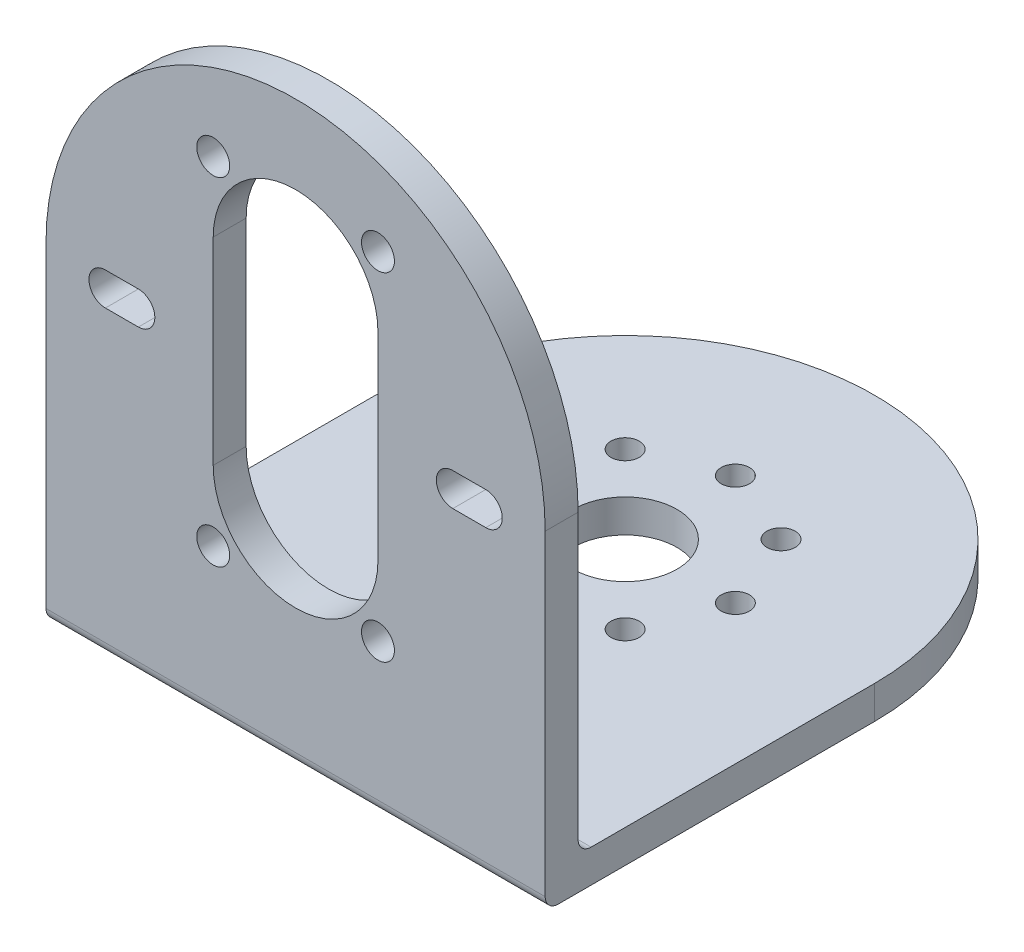
ISO-10303-21;
HEADER;
FILE_DESCRIPTION(('STEP AP214'),'2;1');
FILE_NAME('part.step','',(''),(''),'','','');
FILE_SCHEMA(('AUTOMOTIVE_DESIGN { 1 0 10303 214 1 1 1 1 }'));
ENDSEC;
DATA;
#1=APPLICATION_CONTEXT('core data for automotive mechanical design processes');
#2=APPLICATION_PROTOCOL_DEFINITION('international standard','automotive_design',2000,#1);
#3=PRODUCT_CONTEXT('',#1,'mechanical');
#4=PRODUCT('Part','Part','',(#3));
#5=PRODUCT_RELATED_PRODUCT_CATEGORY('part','',(#4));
#6=PRODUCT_DEFINITION_FORMATION('','',#4);
#7=PRODUCT_DEFINITION_CONTEXT('part definition',#1,'design');
#8=PRODUCT_DEFINITION('design','',#6,#7);
#9=PRODUCT_DEFINITION_SHAPE('','',#8);
#10=(LENGTH_UNIT() NAMED_UNIT(*) SI_UNIT(.MILLI.,.METRE.));
#11=(NAMED_UNIT(*) PLANE_ANGLE_UNIT() SI_UNIT($,.RADIAN.));
#12=(NAMED_UNIT(*) SI_UNIT($,.STERADIAN.) SOLID_ANGLE_UNIT());
#13=UNCERTAINTY_MEASURE_WITH_UNIT(LENGTH_MEASURE(1.E-05),#10,'distance_accuracy_value','');
#14=(GEOMETRIC_REPRESENTATION_CONTEXT(3) GLOBAL_UNCERTAINTY_ASSIGNED_CONTEXT((#13)) GLOBAL_UNIT_ASSIGNED_CONTEXT((#10,
#11,#12)) REPRESENTATION_CONTEXT('',''));
#15=CARTESIAN_POINT('',(0.,0.,0.));
#16=DIRECTION('',(0.,0.,1.));
#17=DIRECTION('',(1.,0.,0.));
#18=AXIS2_PLACEMENT_3D('',#15,#16,#17);
#19=CARTESIAN_POINT('',(0.,2.54,0.));
#20=DIRECTION('',(0.,1.,0.));
#21=DIRECTION('',(0.,0.,1.));
#22=AXIS2_PLACEMENT_3D('',#19,#20,#21);
#23=PLANE('',#22);
#24=CARTESIAN_POINT('',(8.5,2.54,0.));
#25=DIRECTION('',(0.,1.,0.));
#26=DIRECTION('',(-1.,0.,0.));
#27=AXIS2_PLACEMENT_3D('',#24,#25,#26);
#28=CIRCLE('',#27,1.09);
#29=CARTESIAN_POINT('',(7.41,2.54,0.));
#30=VERTEX_POINT('',#29);
#31=EDGE_CURVE('E375',#30,#30,#28,.T.);
#32=ORIENTED_EDGE('',*,*,#31,.F.);
#33=EDGE_LOOP('',(#32));
#34=FACE_BOUND('',#33,.T.);
#35=CARTESIAN_POINT('',(6.01040764008562,2.54,6.01040764008569));
#36=DIRECTION('',(0.,1.,0.));
#37=DIRECTION('',(-0.707106781186544,0.,-0.707106781186551));
#38=AXIS2_PLACEMENT_3D('',#35,#36,#37);
#39=CIRCLE('',#38,1.09);
#40=CARTESIAN_POINT('',(5.23966124859229,2.54,5.23966124859234));
#41=VERTEX_POINT('',#40);
#42=EDGE_CURVE('E385',#41,#41,#39,.T.);
#43=ORIENTED_EDGE('',*,*,#42,.F.);
#44=EDGE_LOOP('',(#43));
#45=FACE_BOUND('',#44,.T.);
#46=CARTESIAN_POINT('',(0.,2.54,8.5));
#47=DIRECTION('',(0.,1.,0.));
#48=DIRECTION('',(0.,0.,-1.));
#49=AXIS2_PLACEMENT_3D('',#46,#47,#48);
#50=CIRCLE('',#49,1.09);
#51=CARTESIAN_POINT('',(0.,2.54,7.41));
#52=VERTEX_POINT('',#51);
#53=EDGE_CURVE('E393',#52,#52,#50,.T.);
#54=ORIENTED_EDGE('',*,*,#53,.F.);
#55=EDGE_LOOP('',(#54));
#56=FACE_BOUND('',#55,.T.);
#57=CARTESIAN_POINT('',(-6.01040764008571,2.54,6.0104076400856));
#58=DIRECTION('',(0.,1.,0.));
#59=DIRECTION('',(0.707106781186554,0.,-0.707106781186541));
#60=AXIS2_PLACEMENT_3D('',#57,#58,#59);
#61=CIRCLE('',#60,1.09);
#62=CARTESIAN_POINT('',(-5.23966124859236,2.54,5.23966124859227));
#63=VERTEX_POINT('',#62);
#64=EDGE_CURVE('E401',#63,#63,#61,.T.);
#65=ORIENTED_EDGE('',*,*,#64,.F.);
#66=EDGE_LOOP('',(#65));
#67=FACE_BOUND('',#66,.T.);
#68=CARTESIAN_POINT('',(-8.5,2.54,0.));
#69=DIRECTION('',(0.,1.,0.));
#70=DIRECTION('',(1.,0.,0.));
#71=AXIS2_PLACEMENT_3D('',#68,#69,#70);
#72=CIRCLE('',#71,1.09);
#73=CARTESIAN_POINT('',(-7.41,2.54,0.));
#74=VERTEX_POINT('',#73);
#75=EDGE_CURVE('E409',#74,#74,#72,.T.);
#76=ORIENTED_EDGE('',*,*,#75,.F.);
#77=EDGE_LOOP('',(#76));
#78=FACE_BOUND('',#77,.T.);
#79=CARTESIAN_POINT('',(-6.01040764008558,2.54,-6.01040764008573));
#80=DIRECTION('',(0.,1.,0.));
#81=DIRECTION('',(0.707106781186539,0.,0.707106781186556));
#82=AXIS2_PLACEMENT_3D('',#79,#80,#81);
#83=CIRCLE('',#82,1.09);
#84=CARTESIAN_POINT('',(-5.23966124859225,2.54,-5.23966124859238));
#85=VERTEX_POINT('',#84);
#86=EDGE_CURVE('E370',#85,#85,#83,.T.);
#87=ORIENTED_EDGE('',*,*,#86,.F.);
#88=EDGE_LOOP('',(#87));
#89=FACE_BOUND('',#88,.T.);
#90=CARTESIAN_POINT('',(6.01040764008567,2.54,-6.01040764008564));
#91=DIRECTION('',(0.,1.,0.));
#92=DIRECTION('',(-0.707106781186549,0.,0.707106781186546));
#93=AXIS2_PLACEMENT_3D('',#90,#91,#92);
#94=CIRCLE('',#93,1.09);
#95=CARTESIAN_POINT('',(5.23966124859233,2.54,-5.23966124859231));
#96=VERTEX_POINT('',#95);
#97=EDGE_CURVE('E384',#96,#96,#94,.T.);
#98=ORIENTED_EDGE('',*,*,#97,.F.);
#99=EDGE_LOOP('',(#98));
#100=FACE_BOUND('',#99,.T.);
#101=CARTESIAN_POINT('',(0.,2.54,-8.5));
#102=DIRECTION('',(0.,1.,0.));
#103=DIRECTION('',(0.,0.,1.));
#104=AXIS2_PLACEMENT_3D('',#101,#102,#103);
#105=CIRCLE('',#104,1.09);
#106=CARTESIAN_POINT('',(0.,2.54,-7.41));
#107=VERTEX_POINT('',#106);
#108=EDGE_CURVE('E431',#107,#107,#105,.T.);
#109=ORIENTED_EDGE('',*,*,#108,.F.);
#110=EDGE_LOOP('',(#109));
#111=FACE_BOUND('',#110,.T.);
#112=CARTESIAN_POINT('',(0.,2.54,0.));
#113=DIRECTION('',(0.,1.,0.));
#114=DIRECTION('',(0.,0.,1.));
#115=AXIS2_PLACEMENT_3D('',#112,#113,#114);
#116=CIRCLE('',#115,4.);
#117=CARTESIAN_POINT('',(0.,2.54,4.));
#118=VERTEX_POINT('',#117);
#119=EDGE_CURVE('E436',#118,#118,#116,.T.);
#120=ORIENTED_EDGE('',*,*,#119,.F.);
#121=EDGE_LOOP('',(#120));
#122=FACE_BOUND('',#121,.T.);
#123=DIRECTION('',(0.,0.,1.));
#124=VECTOR('',#123,1.);
#125=CARTESIAN_POINT('',(-19.24,2.54,0.));
#126=LINE('',#125,#124);
#127=CARTESIAN_POINT('',(-19.24,2.54,0.));
#128=VERTEX_POINT('',#127);
#129=CARTESIAN_POINT('',(-19.24,2.54,21.86));
#130=VERTEX_POINT('',#129);
#131=EDGE_CURVE('E448',#128,#130,#126,.T.);
#132=ORIENTED_EDGE('',*,*,#131,.T.);
#133=DIRECTION('',(1.,0.,0.));
#134=VECTOR('',#133,1.);
#135=CARTESIAN_POINT('',(0.,2.54,21.86));
#136=LINE('',#135,#134);
#137=CARTESIAN_POINT('',(19.24,2.54,21.86));
#138=VERTEX_POINT('',#137);
#139=EDGE_CURVE('E478',#130,#138,#136,.T.);
#140=ORIENTED_EDGE('',*,*,#139,.T.);
#141=DIRECTION('',(0.,0.,-1.));
#142=VECTOR('',#141,1.);
#143=CARTESIAN_POINT('',(19.24,2.54,0.));
#144=LINE('',#143,#142);
#145=CARTESIAN_POINT('',(19.24,2.54,0.));
#146=VERTEX_POINT('',#145);
#147=EDGE_CURVE('E458',#138,#146,#144,.T.);
#148=ORIENTED_EDGE('',*,*,#147,.T.);
#149=CARTESIAN_POINT('',(0.,2.54,0.));
#150=DIRECTION('',(0.,1.,0.));
#151=DIRECTION('',(0.,0.,1.));
#152=AXIS2_PLACEMENT_3D('',#149,#150,#151);
#153=CIRCLE('',#152,19.24);
#154=EDGE_CURVE('E444',#146,#128,#153,.T.);
#155=ORIENTED_EDGE('',*,*,#154,.T.);
#156=EDGE_LOOP('',(#132,#140,#148,#155));
#157=FACE_BOUND('',#156,.T.);
#158=ADVANCED_FACE('F43',(#34,#45,#56,#67,#78,#89,#100,#111,#122,#157),#23,.T.);
#159=CARTESIAN_POINT('',(0.,0.,0.));
#160=DIRECTION('',(0.,1.,0.));
#161=DIRECTION('',(0.,0.,1.));
#162=AXIS2_PLACEMENT_3D('',#159,#160,#161);
#163=PLANE('',#162);
#164=CARTESIAN_POINT('',(8.5,0.,0.));
#165=DIRECTION('',(0.,1.,0.));
#166=DIRECTION('',(-1.,0.,0.));
#167=AXIS2_PLACEMENT_3D('',#164,#165,#166);
#168=CIRCLE('',#167,1.09);
#169=CARTESIAN_POINT('',(7.41,0.,0.));
#170=VERTEX_POINT('',#169);
#171=EDGE_CURVE('E379',#170,#170,#168,.T.);
#172=ORIENTED_EDGE('',*,*,#171,.T.);
#173=EDGE_LOOP('',(#172));
#174=FACE_BOUND('',#173,.T.);
#175=CARTESIAN_POINT('',(6.01040764008562,0.,6.01040764008569));
#176=DIRECTION('',(0.,1.,0.));
#177=DIRECTION('',(-0.707106781186544,0.,-0.707106781186551));
#178=AXIS2_PLACEMENT_3D('',#175,#176,#177);
#179=CIRCLE('',#178,1.09);
#180=CARTESIAN_POINT('',(5.23966124859229,0.,5.23966124859234));
#181=VERTEX_POINT('',#180);
#182=EDGE_CURVE('E380',#181,#181,#179,.T.);
#183=ORIENTED_EDGE('',*,*,#182,.T.);
#184=EDGE_LOOP('',(#183));
#185=FACE_BOUND('',#184,.T.);
#186=CARTESIAN_POINT('',(0.,0.,8.5));
#187=DIRECTION('',(0.,1.,0.));
#188=DIRECTION('',(0.,0.,-1.));
#189=AXIS2_PLACEMENT_3D('',#186,#187,#188);
#190=CIRCLE('',#189,1.09);
#191=CARTESIAN_POINT('',(0.,0.,7.41));
#192=VERTEX_POINT('',#191);
#193=EDGE_CURVE('E389',#192,#192,#190,.T.);
#194=ORIENTED_EDGE('',*,*,#193,.T.);
#195=EDGE_LOOP('',(#194));
#196=FACE_BOUND('',#195,.T.);
#197=CARTESIAN_POINT('',(-6.01040764008571,0.,6.0104076400856));
#198=DIRECTION('',(0.,1.,0.));
#199=DIRECTION('',(0.707106781186554,0.,-0.707106781186541));
#200=AXIS2_PLACEMENT_3D('',#197,#198,#199);
#201=CIRCLE('',#200,1.09);
#202=CARTESIAN_POINT('',(-5.23966124859236,0.,5.23966124859227));
#203=VERTEX_POINT('',#202);
#204=EDGE_CURVE('E397',#203,#203,#201,.T.);
#205=ORIENTED_EDGE('',*,*,#204,.T.);
#206=EDGE_LOOP('',(#205));
#207=FACE_BOUND('',#206,.T.);
#208=CARTESIAN_POINT('',(-8.5,0.,0.));
#209=DIRECTION('',(0.,1.,0.));
#210=DIRECTION('',(1.,0.,0.));
#211=AXIS2_PLACEMENT_3D('',#208,#209,#210);
#212=CIRCLE('',#211,1.09);
#213=CARTESIAN_POINT('',(-7.41,0.,0.));
#214=VERTEX_POINT('',#213);
#215=EDGE_CURVE('E405',#214,#214,#212,.T.);
#216=ORIENTED_EDGE('',*,*,#215,.T.);
#217=EDGE_LOOP('',(#216));
#218=FACE_BOUND('',#217,.T.);
#219=CARTESIAN_POINT('',(-6.01040764008558,0.,-6.01040764008573));
#220=DIRECTION('',(0.,1.,0.));
#221=DIRECTION('',(0.707106781186539,0.,0.707106781186556));
#222=AXIS2_PLACEMENT_3D('',#219,#220,#221);
#223=CIRCLE('',#222,1.09);
#224=CARTESIAN_POINT('',(-5.23966124859225,0.,-5.23966124859238));
#225=VERTEX_POINT('',#224);
#226=EDGE_CURVE('E413',#225,#225,#223,.T.);
#227=ORIENTED_EDGE('',*,*,#226,.T.);
#228=EDGE_LOOP('',(#227));
#229=FACE_BOUND('',#228,.T.);
#230=CARTESIAN_POINT('',(6.01040764008567,0.,-6.01040764008564));
#231=DIRECTION('',(0.,1.,0.));
#232=DIRECTION('',(-0.707106781186549,0.,0.707106781186546));
#233=AXIS2_PLACEMENT_3D('',#230,#231,#232);
#234=CIRCLE('',#233,1.09);
#235=CARTESIAN_POINT('',(5.23966124859233,0.,-5.23966124859231));
#236=VERTEX_POINT('',#235);
#237=EDGE_CURVE('E426',#236,#236,#234,.T.);
#238=ORIENTED_EDGE('',*,*,#237,.T.);
#239=EDGE_LOOP('',(#238));
#240=FACE_BOUND('',#239,.T.);
#241=CARTESIAN_POINT('',(0.,0.,-8.5));
#242=DIRECTION('',(0.,1.,0.));
#243=DIRECTION('',(0.,0.,1.));
#244=AXIS2_PLACEMENT_3D('',#241,#242,#243);
#245=CIRCLE('',#244,1.09);
#246=CARTESIAN_POINT('',(0.,0.,-7.41));
#247=VERTEX_POINT('',#246);
#248=EDGE_CURVE('E430',#247,#247,#245,.T.);
#249=ORIENTED_EDGE('',*,*,#248,.T.);
#250=EDGE_LOOP('',(#249));
#251=FACE_BOUND('',#250,.T.);
#252=DIRECTION('',(0.,0.,-1.));
#253=VECTOR('',#252,1.);
#254=CARTESIAN_POINT('',(19.24,0.,0.));
#255=LINE('',#254,#253);
#256=CARTESIAN_POINT('',(19.24,0.,24.4));
#257=VERTEX_POINT('',#256);
#258=CARTESIAN_POINT('',(19.24,0.,0.));
#259=VERTEX_POINT('',#258);
#260=EDGE_CURVE('E449',#257,#259,#255,.T.);
#261=ORIENTED_EDGE('',*,*,#260,.F.);
#262=DIRECTION('',(1.,0.,0.));
#263=VECTOR('',#262,1.);
#264=CARTESIAN_POINT('',(0.,0.,24.4));
#265=LINE('',#264,#263);
#266=CARTESIAN_POINT('',(-19.24,0.,24.4));
#267=VERTEX_POINT('',#266);
#268=EDGE_CURVE('E471',#257,#267,#265,.F.);
#269=ORIENTED_EDGE('',*,*,#268,.T.);
#270=DIRECTION('',(0.,0.,1.));
#271=VECTOR('',#270,1.);
#272=CARTESIAN_POINT('',(-19.24,0.,0.));
#273=LINE('',#272,#271);
#274=CARTESIAN_POINT('',(-19.24,0.,0.));
#275=VERTEX_POINT('',#274);
#276=EDGE_CURVE('E501',#275,#267,#273,.T.);
#277=ORIENTED_EDGE('',*,*,#276,.F.);
#278=CARTESIAN_POINT('',(0.,0.,0.));
#279=DIRECTION('',(0.,1.,0.));
#280=DIRECTION('',(0.,0.,1.));
#281=AXIS2_PLACEMENT_3D('',#278,#279,#280);
#282=CIRCLE('',#281,19.24);
#283=EDGE_CURVE('E440',#259,#275,#282,.T.);
#284=ORIENTED_EDGE('',*,*,#283,.F.);
#285=EDGE_LOOP('',(#261,#269,#277,#284));
#286=FACE_BOUND('',#285,.T.);
#287=CARTESIAN_POINT('',(0.,0.,0.));
#288=DIRECTION('',(0.,1.,0.));
#289=DIRECTION('',(0.,0.,1.));
#290=AXIS2_PLACEMENT_3D('',#287,#288,#289);
#291=CIRCLE('',#290,4.);
#292=CARTESIAN_POINT('',(0.,0.,4.));
#293=VERTEX_POINT('',#292);
#294=EDGE_CURVE('E435',#293,#293,#291,.T.);
#295=ORIENTED_EDGE('',*,*,#294,.T.);
#296=EDGE_LOOP('',(#295));
#297=FACE_BOUND('',#296,.T.);
#298=ADVANCED_FACE('F536',(#174,#185,#196,#207,#218,#229,#240,#251,#286,#297),#163,.F.);
#299=CARTESIAN_POINT('',(0.,2.54,0.));
#300=DIRECTION('',(0.,-1.,0.));
#301=DIRECTION('',(0.,0.,-1.));
#302=AXIS2_PLACEMENT_3D('',#299,#300,#301);
#303=CYLINDRICAL_SURFACE('',#302,19.24);
#304=ORIENTED_EDGE('',*,*,#283,.T.);
#305=DIRECTION('',(0.,-1.,0.));
#306=VECTOR('',#305,1.);
#307=CARTESIAN_POINT('',(-19.24,2.54,0.));
#308=LINE('',#307,#306);
#309=EDGE_CURVE('E499',#128,#275,#308,.T.);
#310=ORIENTED_EDGE('',*,*,#309,.F.);
#311=ORIENTED_EDGE('',*,*,#154,.F.);
#312=DIRECTION('',(0.,-1.,0.));
#313=VECTOR('',#312,1.);
#314=CARTESIAN_POINT('',(19.24,2.54,0.));
#315=LINE('',#314,#313);
#316=EDGE_CURVE('E509',#146,#259,#315,.T.);
#317=ORIENTED_EDGE('',*,*,#316,.T.);
#318=EDGE_LOOP('',(#304,#310,#311,#317));
#319=FACE_BOUND('',#318,.T.);
#320=ADVANCED_FACE('F508',(#319),#303,.T.);
#321=CARTESIAN_POINT('',(-19.24,2.54,0.));
#322=DIRECTION('',(1.,0.,0.));
#323=DIRECTION('',(0.,0.,-1.));
#324=AXIS2_PLACEMENT_3D('',#321,#322,#323);
#325=PLANE('',#324);
#326=ORIENTED_EDGE('',*,*,#276,.T.);
#327=CARTESIAN_POINT('',(-19.24,1.,24.4));
#328=DIRECTION('',(1.,0.,0.));
#329=DIRECTION('',(0.,0.,-1.));
#330=AXIS2_PLACEMENT_3D('',#327,#328,#329);
#331=CIRCLE('',#330,1.);
#332=CARTESIAN_POINT('',(-19.24,1.,25.4));
#333=VERTEX_POINT('',#332);
#334=EDGE_CURVE('E475',#267,#333,#331,.F.);
#335=ORIENTED_EDGE('',*,*,#334,.T.);
#336=DIRECTION('',(0.,-1.,0.));
#337=VECTOR('',#336,1.);
#338=CARTESIAN_POINT('',(-19.24,2.54,25.4));
#339=LINE('',#338,#337);
#340=CARTESIAN_POINT('',(-19.24,25.4,25.4));
#341=VERTEX_POINT('',#340);
#342=EDGE_CURVE('E505',#341,#333,#339,.T.);
#343=ORIENTED_EDGE('',*,*,#342,.F.);
#344=DIRECTION('',(0.,0.,1.));
#345=VECTOR('',#344,1.);
#346=CARTESIAN_POINT('',(-19.24,25.4,22.86));
#347=LINE('',#346,#345);
#348=CARTESIAN_POINT('',(-19.24,25.4,22.86));
#349=VERTEX_POINT('',#348);
#350=EDGE_CURVE('E366',#349,#341,#347,.T.);
#351=ORIENTED_EDGE('',*,*,#350,.F.);
#352=DIRECTION('',(0.,-1.,0.));
#353=VECTOR('',#352,1.);
#354=CARTESIAN_POINT('',(-19.24,2.54,22.86));
#355=LINE('',#354,#353);
#356=CARTESIAN_POINT('',(-19.24,3.54,22.86));
#357=VERTEX_POINT('',#356);
#358=EDGE_CURVE('E361',#349,#357,#355,.T.);
#359=ORIENTED_EDGE('',*,*,#358,.T.);
#360=CARTESIAN_POINT('',(-19.24,3.54,21.86));
#361=DIRECTION('',(1.,0.,0.));
#362=DIRECTION('',(0.,0.,-1.));
#363=AXIS2_PLACEMENT_3D('',#360,#361,#362);
#364=CIRCLE('',#363,1.);
#365=EDGE_CURVE('E11',#357,#130,#364,.T.);
#366=ORIENTED_EDGE('',*,*,#365,.T.);
#367=ORIENTED_EDGE('',*,*,#131,.F.);
#368=ORIENTED_EDGE('',*,*,#309,.T.);
#369=EDGE_LOOP('',(#326,#335,#343,#351,#359,#366,#367,#368));
#370=FACE_BOUND('',#369,.T.);
#371=ADVANCED_FACE('F498',(#370),#325,.F.);
#372=CARTESIAN_POINT('',(19.24,2.54,25.4));
#373=DIRECTION('',(0.,0.,-1.));
#374=DIRECTION('',(-1.,0.,0.));
#375=AXIS2_PLACEMENT_3D('',#372,#373,#374);
#376=PLANE('',#375);
#377=ORIENTED_EDGE('',*,*,#342,.T.);
#378=DIRECTION('',(1.,0.,0.));
#379=VECTOR('',#378,1.);
#380=CARTESIAN_POINT('',(19.24,1.,25.4));
#381=LINE('',#380,#379);
#382=CARTESIAN_POINT('',(19.24,1.,25.4));
#383=VERTEX_POINT('',#382);
#384=EDGE_CURVE('E472',#333,#383,#381,.T.);
#385=ORIENTED_EDGE('',*,*,#384,.T.);
#386=DIRECTION('',(0.,-1.,0.));
#387=VECTOR('',#386,1.);
#388=CARTESIAN_POINT('',(19.24,2.54,25.4));
#389=LINE('',#388,#387);
#390=CARTESIAN_POINT('',(19.24,25.4,25.4));
#391=VERTEX_POINT('',#390);
#392=EDGE_CURVE('E520',#391,#383,#389,.T.);
#393=ORIENTED_EDGE('',*,*,#392,.F.);
#394=CARTESIAN_POINT('',(0.,25.4,25.4));
#395=DIRECTION('',(0.,0.,1.));
#396=DIRECTION('',(1.,0.,0.));
#397=AXIS2_PLACEMENT_3D('',#394,#395,#396);
#398=CIRCLE('',#397,19.24);
#399=EDGE_CURVE('E347',#391,#341,#398,.T.);
#400=ORIENTED_EDGE('',*,*,#399,.T.);
#401=EDGE_LOOP('',(#377,#385,#393,#400));
#402=FACE_BOUND('',#401,.T.);
#403=CARTESIAN_POINT('',(-14.66,24.62,25.4));
#404=DIRECTION('',(0.,0.,1.));
#405=DIRECTION('',(1.,0.,0.));
#406=AXIS2_PLACEMENT_3D('',#403,#404,#405);
#407=CIRCLE('',#406,1.27);
#408=CARTESIAN_POINT('',(-14.66,25.89,25.4));
#409=VERTEX_POINT('',#408);
#410=CARTESIAN_POINT('',(-14.66,23.35,25.4));
#411=VERTEX_POINT('',#410);
#412=EDGE_CURVE('E188',#409,#411,#407,.T.);
#413=ORIENTED_EDGE('',*,*,#412,.F.);
#414=DIRECTION('',(-1.,0.,0.));
#415=VECTOR('',#414,1.);
#416=CARTESIAN_POINT('',(-14.66,25.89,25.4));
#417=LINE('',#416,#415);
#418=CARTESIAN_POINT('',(-12.12,25.89,25.4));
#419=VERTEX_POINT('',#418);
#420=EDGE_CURVE('E209',#419,#409,#417,.T.);
#421=ORIENTED_EDGE('',*,*,#420,.F.);
#422=CARTESIAN_POINT('',(-12.12,24.62,25.4));
#423=DIRECTION('',(0.,0.,1.));
#424=DIRECTION('',(-1.,0.,0.));
#425=AXIS2_PLACEMENT_3D('',#422,#423,#424);
#426=CIRCLE('',#425,1.27);
#427=CARTESIAN_POINT('',(-12.12,23.35,25.4));
#428=VERTEX_POINT('',#427);
#429=EDGE_CURVE('E213',#428,#419,#426,.T.);
#430=ORIENTED_EDGE('',*,*,#429,.F.);
#431=DIRECTION('',(1.,0.,0.));
#432=VECTOR('',#431,1.);
#433=CARTESIAN_POINT('',(-14.66,23.35,25.4));
#434=LINE('',#433,#432);
#435=EDGE_CURVE('E222',#411,#428,#434,.T.);
#436=ORIENTED_EDGE('',*,*,#435,.F.);
#437=EDGE_LOOP('',(#413,#421,#430,#436));
#438=FACE_BOUND('',#437,.T.);
#439=CARTESIAN_POINT('',(14.66,24.62,25.4));
#440=DIRECTION('',(0.,0.,1.));
#441=DIRECTION('',(-1.,0.,0.));
#442=AXIS2_PLACEMENT_3D('',#439,#440,#441);
#443=CIRCLE('',#442,1.27);
#444=CARTESIAN_POINT('',(14.66,23.35,25.4));
#445=VERTEX_POINT('',#444);
#446=CARTESIAN_POINT('',(14.66,25.89,25.4));
#447=VERTEX_POINT('',#446);
#448=EDGE_CURVE('E231',#445,#447,#443,.T.);
#449=ORIENTED_EDGE('',*,*,#448,.F.);
#450=DIRECTION('',(1.,0.,0.));
#451=VECTOR('',#450,1.);
#452=CARTESIAN_POINT('',(14.66,23.35,25.4));
#453=LINE('',#452,#451);
#454=CARTESIAN_POINT('',(12.12,23.35,25.4));
#455=VERTEX_POINT('',#454);
#456=EDGE_CURVE('E242',#455,#445,#453,.T.);
#457=ORIENTED_EDGE('',*,*,#456,.F.);
#458=CARTESIAN_POINT('',(12.12,24.62,25.4));
#459=DIRECTION('',(0.,0.,1.));
#460=DIRECTION('',(1.,0.,0.));
#461=AXIS2_PLACEMENT_3D('',#458,#459,#460);
#462=CIRCLE('',#461,1.27);
#463=CARTESIAN_POINT('',(12.12,25.89,25.4));
#464=VERTEX_POINT('',#463);
#465=EDGE_CURVE('E261',#464,#455,#462,.T.);
#466=ORIENTED_EDGE('',*,*,#465,.F.);
#467=DIRECTION('',(-1.,0.,0.));
#468=VECTOR('',#467,1.);
#469=CARTESIAN_POINT('',(14.66,25.89,25.4));
#470=LINE('',#469,#468);
#471=EDGE_CURVE('E257',#447,#464,#470,.T.);
#472=ORIENTED_EDGE('',*,*,#471,.F.);
#473=EDGE_LOOP('',(#449,#457,#466,#472));
#474=FACE_BOUND('',#473,.T.);
#475=CARTESIAN_POINT('',(-6.35,37.62,25.4));
#476=DIRECTION('',(0.,0.,1.));
#477=DIRECTION('',(-1.,0.,0.));
#478=AXIS2_PLACEMENT_3D('',#475,#476,#477);
#479=CIRCLE('',#478,1.27);
#480=CARTESIAN_POINT('',(-7.61999999999999,37.62,25.4));
#481=VERTEX_POINT('',#480);
#482=EDGE_CURVE('E271',#481,#481,#479,.T.);
#483=ORIENTED_EDGE('',*,*,#482,.F.);
#484=EDGE_LOOP('',(#483));
#485=FACE_BOUND('',#484,.T.);
#486=CARTESIAN_POINT('',(-6.35000000000001,11.62,25.4));
#487=DIRECTION('',(0.,0.,1.));
#488=DIRECTION('',(-1.,0.,0.));
#489=AXIS2_PLACEMENT_3D('',#486,#487,#488);
#490=CIRCLE('',#489,1.27);
#491=CARTESIAN_POINT('',(-7.62000000000001,11.62,25.4));
#492=VERTEX_POINT('',#491);
#493=EDGE_CURVE('E285',#492,#492,#490,.T.);
#494=ORIENTED_EDGE('',*,*,#493,.F.);
#495=EDGE_LOOP('',(#494));
#496=FACE_BOUND('',#495,.T.);
#497=CARTESIAN_POINT('',(6.35000000000001,11.62,25.4));
#498=DIRECTION('',(0.,0.,1.));
#499=DIRECTION('',(1.,0.,0.));
#500=AXIS2_PLACEMENT_3D('',#497,#498,#499);
#501=CIRCLE('',#500,1.27);
#502=CARTESIAN_POINT('',(7.62000000000001,11.62,25.4));
#503=VERTEX_POINT('',#502);
#504=EDGE_CURVE('E293',#503,#503,#501,.T.);
#505=ORIENTED_EDGE('',*,*,#504,.F.);
#506=EDGE_LOOP('',(#505));
#507=FACE_BOUND('',#506,.T.);
#508=CARTESIAN_POINT('',(6.35,37.62,25.4));
#509=DIRECTION('',(0.,0.,1.));
#510=DIRECTION('',(1.,0.,0.));
#511=AXIS2_PLACEMENT_3D('',#508,#509,#510);
#512=CIRCLE('',#511,1.27);
#513=CARTESIAN_POINT('',(7.62,37.62,25.4));
#514=VERTEX_POINT('',#513);
#515=EDGE_CURVE('E301',#514,#514,#512,.T.);
#516=ORIENTED_EDGE('',*,*,#515,.F.);
#517=EDGE_LOOP('',(#516));
#518=FACE_BOUND('',#517,.T.);
#519=CARTESIAN_POINT('',(0.,32.24,25.4));
#520=DIRECTION('',(0.,0.,1.));
#521=DIRECTION('',(1.,0.,0.));
#522=AXIS2_PLACEMENT_3D('',#519,#520,#521);
#523=CIRCLE('',#522,6.35);
#524=CARTESIAN_POINT('',(6.35,32.24,25.4));
#525=VERTEX_POINT('',#524);
#526=CARTESIAN_POINT('',(-6.35,32.24,25.4));
#527=VERTEX_POINT('',#526);
#528=EDGE_CURVE('E309',#525,#527,#523,.T.);
#529=ORIENTED_EDGE('',*,*,#528,.F.);
#530=DIRECTION('',(0.,1.,0.));
#531=VECTOR('',#530,1.);
#532=CARTESIAN_POINT('',(6.35,32.24,25.4));
#533=LINE('',#532,#531);
#534=CARTESIAN_POINT('',(6.35,17.,25.4));
#535=VERTEX_POINT('',#534);
#536=EDGE_CURVE('E318',#535,#525,#533,.T.);
#537=ORIENTED_EDGE('',*,*,#536,.F.);
#538=CARTESIAN_POINT('',(0.,17.,25.4));
#539=DIRECTION('',(0.,0.,1.));
#540=DIRECTION('',(-1.,0.,0.));
#541=AXIS2_PLACEMENT_3D('',#538,#539,#540);
#542=CIRCLE('',#541,6.35);
#543=CARTESIAN_POINT('',(-6.35,17.,25.4));
#544=VERTEX_POINT('',#543);
#545=EDGE_CURVE('E337',#544,#535,#542,.T.);
#546=ORIENTED_EDGE('',*,*,#545,.F.);
#547=DIRECTION('',(0.,-1.,0.));
#548=VECTOR('',#547,1.);
#549=CARTESIAN_POINT('',(-6.35,32.24,25.4));
#550=LINE('',#549,#548);
#551=EDGE_CURVE('E333',#527,#544,#550,.T.);
#552=ORIENTED_EDGE('',*,*,#551,.F.);
#553=EDGE_LOOP('',(#529,#537,#546,#552));
#554=FACE_BOUND('',#553,.T.);
#555=ADVANCED_FACE('F528',(#402,#438,#474,#485,#496,#507,#518,#554),#376,.F.);
#556=CARTESIAN_POINT('',(19.24,2.54,0.));
#557=DIRECTION('',(-1.,0.,0.));
#558=DIRECTION('',(0.,0.,1.));
#559=AXIS2_PLACEMENT_3D('',#556,#557,#558);
#560=PLANE('',#559);
#561=ORIENTED_EDGE('',*,*,#392,.T.);
#562=CARTESIAN_POINT('',(19.24,1.,24.4));
#563=DIRECTION('',(-1.,0.,0.));
#564=DIRECTION('',(0.,0.,1.));
#565=AXIS2_PLACEMENT_3D('',#562,#563,#564);
#566=CIRCLE('',#565,1.);
#567=EDGE_CURVE('E468',#383,#257,#566,.F.);
#568=ORIENTED_EDGE('',*,*,#567,.T.);
#569=ORIENTED_EDGE('',*,*,#260,.T.);
#570=ORIENTED_EDGE('',*,*,#316,.F.);
#571=ORIENTED_EDGE('',*,*,#147,.F.);
#572=CARTESIAN_POINT('',(19.24,3.54,21.86));
#573=DIRECTION('',(-1.,0.,0.));
#574=DIRECTION('',(0.,0.,1.));
#575=AXIS2_PLACEMENT_3D('',#572,#573,#574);
#576=CIRCLE('',#575,1.);
#577=CARTESIAN_POINT('',(19.24,3.54,22.86));
#578=VERTEX_POINT('',#577);
#579=EDGE_CURVE('E52',#138,#578,#576,.T.);
#580=ORIENTED_EDGE('',*,*,#579,.T.);
#581=DIRECTION('',(0.,1.,0.));
#582=VECTOR('',#581,1.);
#583=CARTESIAN_POINT('',(19.24,2.54,22.86));
#584=LINE('',#583,#582);
#585=CARTESIAN_POINT('',(19.24,25.4,22.86));
#586=VERTEX_POINT('',#585);
#587=EDGE_CURVE('E362',#578,#586,#584,.T.);
#588=ORIENTED_EDGE('',*,*,#587,.T.);
#589=DIRECTION('',(0.,0.,1.));
#590=VECTOR('',#589,1.);
#591=CARTESIAN_POINT('',(19.24,25.4,22.86));
#592=LINE('',#591,#590);
#593=EDGE_CURVE('E371',#586,#391,#592,.T.);
#594=ORIENTED_EDGE('',*,*,#593,.T.);
#595=EDGE_LOOP('',(#561,#568,#569,#570,#571,#580,#588,#594));
#596=FACE_BOUND('',#595,.T.);
#597=ADVANCED_FACE('F487',(#596),#560,.F.);
#598=CARTESIAN_POINT('',(0.,2.54,0.));
#599=DIRECTION('',(0.,-1.,0.));
#600=DIRECTION('',(0.,0.,-1.));
#601=AXIS2_PLACEMENT_3D('',#598,#599,#600);
#602=CYLINDRICAL_SURFACE('',#601,4.);
#603=ORIENTED_EDGE('',*,*,#119,.T.);
#604=EDGE_LOOP('',(#603));
#605=FACE_BOUND('',#604,.T.);
#606=ORIENTED_EDGE('',*,*,#294,.F.);
#607=EDGE_LOOP('',(#606));
#608=FACE_BOUND('',#607,.T.);
#609=ADVANCED_FACE('F543',(#605,#608),#602,.F.);
#610=CARTESIAN_POINT('',(0.,-2.46,-8.5));
#611=DIRECTION('',(0.,1.,0.));
#612=DIRECTION('',(0.,0.,1.));
#613=AXIS2_PLACEMENT_3D('',#610,#611,#612);
#614=CYLINDRICAL_SURFACE('',#613,1.09);
#615=ORIENTED_EDGE('',*,*,#108,.T.);
#616=EDGE_LOOP('',(#615));
#617=FACE_BOUND('',#616,.T.);
#618=ORIENTED_EDGE('',*,*,#248,.F.);
#619=EDGE_LOOP('',(#618));
#620=FACE_BOUND('',#619,.T.);
#621=ADVANCED_FACE('F545',(#617,#620),#614,.F.);
#622=CARTESIAN_POINT('',(6.01040764008567,-2.46,-6.01040764008564));
#623=DIRECTION('',(0.,1.,0.));
#624=DIRECTION('',(-0.707106781186549,0.,0.707106781186546));
#625=AXIS2_PLACEMENT_3D('',#622,#623,#624);
#626=CYLINDRICAL_SURFACE('',#625,1.09);
#627=ORIENTED_EDGE('',*,*,#97,.T.);
#628=EDGE_LOOP('',(#627));
#629=FACE_BOUND('',#628,.T.);
#630=ORIENTED_EDGE('',*,*,#237,.F.);
#631=EDGE_LOOP('',(#630));
#632=FACE_BOUND('',#631,.T.);
#633=ADVANCED_FACE('F552',(#629,#632),#626,.F.);
#634=CARTESIAN_POINT('',(-6.01040764008558,-2.46,-6.01040764008573));
#635=DIRECTION('',(0.,1.,0.));
#636=DIRECTION('',(0.707106781186539,0.,0.707106781186556));
#637=AXIS2_PLACEMENT_3D('',#634,#635,#636);
#638=CYLINDRICAL_SURFACE('',#637,1.09);
#639=ORIENTED_EDGE('',*,*,#86,.T.);
#640=EDGE_LOOP('',(#639));
#641=FACE_BOUND('',#640,.T.);
#642=ORIENTED_EDGE('',*,*,#226,.F.);
#643=EDGE_LOOP('',(#642));
#644=FACE_BOUND('',#643,.T.);
#645=ADVANCED_FACE('F659',(#641,#644),#638,.F.);
#646=CARTESIAN_POINT('',(-8.5,-2.46,0.));
#647=DIRECTION('',(0.,1.,0.));
#648=DIRECTION('',(1.,0.,0.));
#649=AXIS2_PLACEMENT_3D('',#646,#647,#648);
#650=CYLINDRICAL_SURFACE('',#649,1.09);
#651=ORIENTED_EDGE('',*,*,#75,.T.);
#652=EDGE_LOOP('',(#651));
#653=FACE_BOUND('',#652,.T.);
#654=ORIENTED_EDGE('',*,*,#215,.F.);
#655=EDGE_LOOP('',(#654));
#656=FACE_BOUND('',#655,.T.);
#657=ADVANCED_FACE('F655',(#653,#656),#650,.F.);
#658=CARTESIAN_POINT('',(-6.01040764008571,-2.46,6.0104076400856));
#659=DIRECTION('',(0.,1.,0.));
#660=DIRECTION('',(0.707106781186554,0.,-0.707106781186541));
#661=AXIS2_PLACEMENT_3D('',#658,#659,#660);
#662=CYLINDRICAL_SURFACE('',#661,1.09);
#663=ORIENTED_EDGE('',*,*,#64,.T.);
#664=EDGE_LOOP('',(#663));
#665=FACE_BOUND('',#664,.T.);
#666=ORIENTED_EDGE('',*,*,#204,.F.);
#667=EDGE_LOOP('',(#666));
#668=FACE_BOUND('',#667,.T.);
#669=ADVANCED_FACE('F651',(#665,#668),#662,.F.);
#670=CARTESIAN_POINT('',(0.,-2.46,8.5));
#671=DIRECTION('',(0.,1.,0.));
#672=DIRECTION('',(0.,0.,-1.));
#673=AXIS2_PLACEMENT_3D('',#670,#671,#672);
#674=CYLINDRICAL_SURFACE('',#673,1.09);
#675=ORIENTED_EDGE('',*,*,#53,.T.);
#676=EDGE_LOOP('',(#675));
#677=FACE_BOUND('',#676,.T.);
#678=ORIENTED_EDGE('',*,*,#193,.F.);
#679=EDGE_LOOP('',(#678));
#680=FACE_BOUND('',#679,.T.);
#681=ADVANCED_FACE('F647',(#677,#680),#674,.F.);
#682=CARTESIAN_POINT('',(6.01040764008562,-2.46,6.01040764008569));
#683=DIRECTION('',(0.,1.,0.));
#684=DIRECTION('',(-0.707106781186544,0.,-0.707106781186551));
#685=AXIS2_PLACEMENT_3D('',#682,#683,#684);
#686=CYLINDRICAL_SURFACE('',#685,1.09);
#687=ORIENTED_EDGE('',*,*,#42,.T.);
#688=EDGE_LOOP('',(#687));
#689=FACE_BOUND('',#688,.T.);
#690=ORIENTED_EDGE('',*,*,#182,.F.);
#691=EDGE_LOOP('',(#690));
#692=FACE_BOUND('',#691,.T.);
#693=ADVANCED_FACE('F643',(#689,#692),#686,.F.);
#694=CARTESIAN_POINT('',(8.5,-2.46,0.));
#695=DIRECTION('',(0.,1.,0.));
#696=DIRECTION('',(-1.,0.,0.));
#697=AXIS2_PLACEMENT_3D('',#694,#695,#696);
#698=CYLINDRICAL_SURFACE('',#697,1.09);
#699=ORIENTED_EDGE('',*,*,#31,.T.);
#700=EDGE_LOOP('',(#699));
#701=FACE_BOUND('',#700,.T.);
#702=ORIENTED_EDGE('',*,*,#171,.F.);
#703=EDGE_LOOP('',(#702));
#704=FACE_BOUND('',#703,.T.);
#705=ADVANCED_FACE('F639',(#701,#704),#698,.F.);
#706=CARTESIAN_POINT('',(0.,25.4,22.86));
#707=DIRECTION('',(0.,0.,1.));
#708=DIRECTION('',(1.,0.,0.));
#709=AXIS2_PLACEMENT_3D('',#706,#707,#708);
#710=CYLINDRICAL_SURFACE('',#709,19.24);
#711=ORIENTED_EDGE('',*,*,#399,.F.);
#712=ORIENTED_EDGE('',*,*,#593,.F.);
#713=CARTESIAN_POINT('',(0.,25.4,22.86));
#714=DIRECTION('',(0.,0.,1.));
#715=DIRECTION('',(1.,0.,0.));
#716=AXIS2_PLACEMENT_3D('',#713,#714,#715);
#717=CIRCLE('',#716,19.24);
#718=EDGE_CURVE('E357',#586,#349,#717,.T.);
#719=ORIENTED_EDGE('',*,*,#718,.T.);
#720=ORIENTED_EDGE('',*,*,#350,.T.);
#721=EDGE_LOOP('',(#711,#712,#719,#720));
#722=FACE_BOUND('',#721,.T.);
#723=ADVANCED_FACE('F636',(#722),#710,.T.);
#724=CARTESIAN_POINT('',(0.,25.4,22.86));
#725=DIRECTION('',(0.,0.,1.));
#726=DIRECTION('',(1.,0.,0.));
#727=AXIS2_PLACEMENT_3D('',#724,#725,#726);
#728=PLANE('',#727);
#729=DIRECTION('',(-1.,0.,0.));
#730=VECTOR('',#729,1.);
#731=CARTESIAN_POINT('',(-14.66,25.89,22.86));
#732=LINE('',#731,#730);
#733=CARTESIAN_POINT('',(-12.12,25.89,22.86));
#734=VERTEX_POINT('',#733);
#735=CARTESIAN_POINT('',(-14.66,25.89,22.86));
#736=VERTEX_POINT('',#735);
#737=EDGE_CURVE('E194',#734,#736,#732,.T.);
#738=ORIENTED_EDGE('',*,*,#737,.T.);
#739=CARTESIAN_POINT('',(-14.66,24.62,22.86));
#740=DIRECTION('',(0.,0.,1.));
#741=DIRECTION('',(1.,0.,0.));
#742=AXIS2_PLACEMENT_3D('',#739,#740,#741);
#743=CIRCLE('',#742,1.27);
#744=CARTESIAN_POINT('',(-14.66,23.35,22.86));
#745=VERTEX_POINT('',#744);
#746=EDGE_CURVE('E185',#736,#745,#743,.T.);
#747=ORIENTED_EDGE('',*,*,#746,.T.);
#748=DIRECTION('',(1.,0.,0.));
#749=VECTOR('',#748,1.);
#750=CARTESIAN_POINT('',(-14.66,23.35,22.86));
#751=LINE('',#750,#749);
#752=CARTESIAN_POINT('',(-12.12,23.35,22.86));
#753=VERTEX_POINT('',#752);
#754=EDGE_CURVE('E198',#745,#753,#751,.T.);
#755=ORIENTED_EDGE('',*,*,#754,.T.);
#756=CARTESIAN_POINT('',(-12.12,24.62,22.86));
#757=DIRECTION('',(0.,0.,1.));
#758=DIRECTION('',(-1.,0.,0.));
#759=AXIS2_PLACEMENT_3D('',#756,#757,#758);
#760=CIRCLE('',#759,1.27);
#761=EDGE_CURVE('E203',#753,#734,#760,.T.);
#762=ORIENTED_EDGE('',*,*,#761,.T.);
#763=EDGE_LOOP('',(#738,#747,#755,#762));
#764=FACE_BOUND('',#763,.T.);
#765=DIRECTION('',(1.,0.,0.));
#766=VECTOR('',#765,1.);
#767=CARTESIAN_POINT('',(14.66,23.35,22.86));
#768=LINE('',#767,#766);
#769=CARTESIAN_POINT('',(12.12,23.35,22.86));
#770=VERTEX_POINT('',#769);
#771=CARTESIAN_POINT('',(14.66,23.35,22.86));
#772=VERTEX_POINT('',#771);
#773=EDGE_CURVE('E250',#770,#772,#768,.T.);
#774=ORIENTED_EDGE('',*,*,#773,.T.);
#775=CARTESIAN_POINT('',(14.66,24.62,22.86));
#776=DIRECTION('',(0.,0.,1.));
#777=DIRECTION('',(-1.,0.,0.));
#778=AXIS2_PLACEMENT_3D('',#775,#776,#777);
#779=CIRCLE('',#778,1.27);
#780=CARTESIAN_POINT('',(14.66,25.89,22.86));
#781=VERTEX_POINT('',#780);
#782=EDGE_CURVE('E237',#772,#781,#779,.T.);
#783=ORIENTED_EDGE('',*,*,#782,.T.);
#784=DIRECTION('',(-1.,0.,0.));
#785=VECTOR('',#784,1.);
#786=CARTESIAN_POINT('',(14.66,25.89,22.86));
#787=LINE('',#786,#785);
#788=CARTESIAN_POINT('',(12.12,25.89,22.86));
#789=VERTEX_POINT('',#788);
#790=EDGE_CURVE('E241',#781,#789,#787,.T.);
#791=ORIENTED_EDGE('',*,*,#790,.T.);
#792=CARTESIAN_POINT('',(12.12,24.62,22.86));
#793=DIRECTION('',(0.,0.,1.));
#794=DIRECTION('',(1.,0.,0.));
#795=AXIS2_PLACEMENT_3D('',#792,#793,#794);
#796=CIRCLE('',#795,1.27);
#797=EDGE_CURVE('E246',#789,#770,#796,.T.);
#798=ORIENTED_EDGE('',*,*,#797,.T.);
#799=EDGE_LOOP('',(#774,#783,#791,#798));
#800=FACE_BOUND('',#799,.T.);
#801=CARTESIAN_POINT('',(-6.35,37.62,22.86));
#802=DIRECTION('',(0.,0.,1.));
#803=DIRECTION('',(-1.,0.,0.));
#804=AXIS2_PLACEMENT_3D('',#801,#802,#803);
#805=CIRCLE('',#804,1.27);
#806=CARTESIAN_POINT('',(-7.61999999999999,37.62,22.86));
#807=VERTEX_POINT('',#806);
#808=EDGE_CURVE('E281',#807,#807,#805,.T.);
#809=ORIENTED_EDGE('',*,*,#808,.T.);
#810=EDGE_LOOP('',(#809));
#811=FACE_BOUND('',#810,.T.);
#812=CARTESIAN_POINT('',(-6.35000000000001,11.62,22.86));
#813=DIRECTION('',(0.,0.,1.));
#814=DIRECTION('',(-1.,0.,0.));
#815=AXIS2_PLACEMENT_3D('',#812,#813,#814);
#816=CIRCLE('',#815,1.27);
#817=CARTESIAN_POINT('',(-7.62000000000001,11.62,22.86));
#818=VERTEX_POINT('',#817);
#819=EDGE_CURVE('E289',#818,#818,#816,.T.);
#820=ORIENTED_EDGE('',*,*,#819,.T.);
#821=EDGE_LOOP('',(#820));
#822=FACE_BOUND('',#821,.T.);
#823=CARTESIAN_POINT('',(6.35000000000001,11.62,22.86));
#824=DIRECTION('',(0.,0.,1.));
#825=DIRECTION('',(1.,0.,0.));
#826=AXIS2_PLACEMENT_3D('',#823,#824,#825);
#827=CIRCLE('',#826,1.27);
#828=CARTESIAN_POINT('',(7.62000000000001,11.62,22.86));
#829=VERTEX_POINT('',#828);
#830=EDGE_CURVE('E297',#829,#829,#827,.T.);
#831=ORIENTED_EDGE('',*,*,#830,.T.);
#832=EDGE_LOOP('',(#831));
#833=FACE_BOUND('',#832,.T.);
#834=CARTESIAN_POINT('',(6.35,37.62,22.86));
#835=DIRECTION('',(0.,0.,1.));
#836=DIRECTION('',(1.,0.,0.));
#837=AXIS2_PLACEMENT_3D('',#834,#835,#836);
#838=CIRCLE('',#837,1.27);
#839=CARTESIAN_POINT('',(7.62,37.62,22.86));
#840=VERTEX_POINT('',#839);
#841=EDGE_CURVE('E305',#840,#840,#838,.T.);
#842=ORIENTED_EDGE('',*,*,#841,.T.);
#843=EDGE_LOOP('',(#842));
#844=FACE_BOUND('',#843,.T.);
#845=DIRECTION('',(0.,1.,0.));
#846=VECTOR('',#845,1.);
#847=CARTESIAN_POINT('',(6.35,32.24,22.86));
#848=LINE('',#847,#846);
#849=CARTESIAN_POINT('',(6.35,17.,22.86));
#850=VERTEX_POINT('',#849);
#851=CARTESIAN_POINT('',(6.35,32.24,22.86));
#852=VERTEX_POINT('',#851);
#853=EDGE_CURVE('E326',#850,#852,#848,.T.);
#854=ORIENTED_EDGE('',*,*,#853,.T.);
#855=CARTESIAN_POINT('',(0.,32.24,22.86));
#856=DIRECTION('',(0.,0.,1.));
#857=DIRECTION('',(1.,0.,0.));
#858=AXIS2_PLACEMENT_3D('',#855,#856,#857);
#859=CIRCLE('',#858,6.35);
#860=CARTESIAN_POINT('',(-6.35,32.24,22.86));
#861=VERTEX_POINT('',#860);
#862=EDGE_CURVE('E313',#852,#861,#859,.T.);
#863=ORIENTED_EDGE('',*,*,#862,.T.);
#864=DIRECTION('',(0.,-1.,0.));
#865=VECTOR('',#864,1.);
#866=CARTESIAN_POINT('',(-6.35,32.24,22.86));
#867=LINE('',#866,#865);
#868=CARTESIAN_POINT('',(-6.35,17.,22.86));
#869=VERTEX_POINT('',#868);
#870=EDGE_CURVE('E317',#861,#869,#867,.T.);
#871=ORIENTED_EDGE('',*,*,#870,.T.);
#872=CARTESIAN_POINT('',(0.,17.,22.86));
#873=DIRECTION('',(0.,0.,1.));
#874=DIRECTION('',(-1.,0.,0.));
#875=AXIS2_PLACEMENT_3D('',#872,#873,#874);
#876=CIRCLE('',#875,6.35);
#877=EDGE_CURVE('E322',#869,#850,#876,.T.);
#878=ORIENTED_EDGE('',*,*,#877,.T.);
#879=EDGE_LOOP('',(#854,#863,#871,#878));
#880=FACE_BOUND('',#879,.T.);
#881=ORIENTED_EDGE('',*,*,#587,.F.);
#882=DIRECTION('',(1.,0.,0.));
#883=VECTOR('',#882,1.);
#884=CARTESIAN_POINT('',(0.,3.54,22.86));
#885=LINE('',#884,#883);
#886=EDGE_CURVE('E65',#578,#357,#885,.F.);
#887=ORIENTED_EDGE('',*,*,#886,.T.);
#888=ORIENTED_EDGE('',*,*,#358,.F.);
#889=ORIENTED_EDGE('',*,*,#718,.F.);
#890=EDGE_LOOP('',(#881,#887,#888,#889));
#891=FACE_BOUND('',#890,.T.);
#892=ADVANCED_FACE('F205',(#764,#800,#811,#822,#833,#844,#880,#891),#728,.F.);
#893=CARTESIAN_POINT('',(0.,32.24,22.86));
#894=DIRECTION('',(0.,0.,1.));
#895=DIRECTION('',(1.,0.,0.));
#896=AXIS2_PLACEMENT_3D('',#893,#894,#895);
#897=CYLINDRICAL_SURFACE('',#896,6.35);
#898=ORIENTED_EDGE('',*,*,#528,.T.);
#899=DIRECTION('',(0.,0.,1.));
#900=VECTOR('',#899,1.);
#901=CARTESIAN_POINT('',(-6.35,32.24,22.86));
#902=LINE('',#901,#900);
#903=EDGE_CURVE('E330',#861,#527,#902,.T.);
#904=ORIENTED_EDGE('',*,*,#903,.F.);
#905=ORIENTED_EDGE('',*,*,#862,.F.);
#906=DIRECTION('',(0.,0.,1.));
#907=VECTOR('',#906,1.);
#908=CARTESIAN_POINT('',(6.35,32.24,22.86));
#909=LINE('',#908,#907);
#910=EDGE_CURVE('E344',#852,#525,#909,.T.);
#911=ORIENTED_EDGE('',*,*,#910,.T.);
#912=EDGE_LOOP('',(#898,#904,#905,#911));
#913=FACE_BOUND('',#912,.T.);
#914=ADVANCED_FACE('F623',(#913),#897,.F.);
#915=CARTESIAN_POINT('',(6.35,32.24,22.86));
#916=DIRECTION('',(1.,0.,0.));
#917=DIRECTION('',(0.,1.,0.));
#918=AXIS2_PLACEMENT_3D('',#915,#916,#917);
#919=PLANE('',#918);
#920=ORIENTED_EDGE('',*,*,#536,.T.);
#921=ORIENTED_EDGE('',*,*,#910,.F.);
#922=ORIENTED_EDGE('',*,*,#853,.F.);
#923=DIRECTION('',(0.,0.,1.));
#924=VECTOR('',#923,1.);
#925=CARTESIAN_POINT('',(6.35,17.,22.86));
#926=LINE('',#925,#924);
#927=EDGE_CURVE('E348',#850,#535,#926,.T.);
#928=ORIENTED_EDGE('',*,*,#927,.T.);
#929=EDGE_LOOP('',(#920,#921,#922,#928));
#930=FACE_BOUND('',#929,.T.);
#931=ADVANCED_FACE('F619',(#930),#919,.F.);
#932=CARTESIAN_POINT('',(0.,17.,22.86));
#933=DIRECTION('',(0.,0.,1.));
#934=DIRECTION('',(1.,0.,0.));
#935=AXIS2_PLACEMENT_3D('',#932,#933,#934);
#936=CYLINDRICAL_SURFACE('',#935,6.35);
#937=ORIENTED_EDGE('',*,*,#545,.T.);
#938=ORIENTED_EDGE('',*,*,#927,.F.);
#939=ORIENTED_EDGE('',*,*,#877,.F.);
#940=DIRECTION('',(0.,0.,1.));
#941=VECTOR('',#940,1.);
#942=CARTESIAN_POINT('',(-6.35,17.,22.86));
#943=LINE('',#942,#941);
#944=EDGE_CURVE('E351',#869,#544,#943,.T.);
#945=ORIENTED_EDGE('',*,*,#944,.T.);
#946=EDGE_LOOP('',(#937,#938,#939,#945));
#947=FACE_BOUND('',#946,.T.);
#948=ADVANCED_FACE('F622',(#947),#936,.F.);
#949=CARTESIAN_POINT('',(-6.35,32.24,22.86));
#950=DIRECTION('',(-1.,0.,0.));
#951=DIRECTION('',(0.,-1.,0.));
#952=AXIS2_PLACEMENT_3D('',#949,#950,#951);
#953=PLANE('',#952);
#954=ORIENTED_EDGE('',*,*,#551,.T.);
#955=ORIENTED_EDGE('',*,*,#944,.F.);
#956=ORIENTED_EDGE('',*,*,#870,.F.);
#957=ORIENTED_EDGE('',*,*,#903,.T.);
#958=EDGE_LOOP('',(#954,#955,#956,#957));
#959=FACE_BOUND('',#958,.T.);
#960=ADVANCED_FACE('F617',(#959),#953,.F.);
#961=CARTESIAN_POINT('',(6.35,37.62,22.86));
#962=DIRECTION('',(0.,0.,1.));
#963=DIRECTION('',(1.,0.,0.));
#964=AXIS2_PLACEMENT_3D('',#961,#962,#963);
#965=CYLINDRICAL_SURFACE('',#964,1.27);
#966=ORIENTED_EDGE('',*,*,#841,.F.);
#967=EDGE_LOOP('',(#966));
#968=FACE_BOUND('',#967,.T.);
#969=ORIENTED_EDGE('',*,*,#515,.T.);
#970=EDGE_LOOP('',(#969));
#971=FACE_BOUND('',#970,.T.);
#972=ADVANCED_FACE('F613',(#968,#971),#965,.F.);
#973=CARTESIAN_POINT('',(6.35000000000001,11.62,22.86));
#974=DIRECTION('',(0.,0.,1.));
#975=DIRECTION('',(1.,0.,0.));
#976=AXIS2_PLACEMENT_3D('',#973,#974,#975);
#977=CYLINDRICAL_SURFACE('',#976,1.27);
#978=ORIENTED_EDGE('',*,*,#830,.F.);
#979=EDGE_LOOP('',(#978));
#980=FACE_BOUND('',#979,.T.);
#981=ORIENTED_EDGE('',*,*,#504,.T.);
#982=EDGE_LOOP('',(#981));
#983=FACE_BOUND('',#982,.T.);
#984=ADVANCED_FACE('F609',(#980,#983),#977,.F.);
#985=CARTESIAN_POINT('',(-6.35000000000001,11.62,22.86));
#986=DIRECTION('',(0.,0.,1.));
#987=DIRECTION('',(1.,0.,0.));
#988=AXIS2_PLACEMENT_3D('',#985,#986,#987);
#989=CYLINDRICAL_SURFACE('',#988,1.27);
#990=ORIENTED_EDGE('',*,*,#819,.F.);
#991=EDGE_LOOP('',(#990));
#992=FACE_BOUND('',#991,.T.);
#993=ORIENTED_EDGE('',*,*,#493,.T.);
#994=EDGE_LOOP('',(#993));
#995=FACE_BOUND('',#994,.T.);
#996=ADVANCED_FACE('F605',(#992,#995),#989,.F.);
#997=CARTESIAN_POINT('',(-6.35,37.62,22.86));
#998=DIRECTION('',(0.,0.,1.));
#999=DIRECTION('',(1.,0.,0.));
#1000=AXIS2_PLACEMENT_3D('',#997,#998,#999);
#1001=CYLINDRICAL_SURFACE('',#1000,1.27);
#1002=ORIENTED_EDGE('',*,*,#808,.F.);
#1003=EDGE_LOOP('',(#1002));
#1004=FACE_BOUND('',#1003,.T.);
#1005=ORIENTED_EDGE('',*,*,#482,.T.);
#1006=EDGE_LOOP('',(#1005));
#1007=FACE_BOUND('',#1006,.T.);
#1008=ADVANCED_FACE('F601',(#1004,#1007),#1001,.F.);
#1009=CARTESIAN_POINT('',(14.66,24.62,22.86));
#1010=DIRECTION('',(0.,0.,1.));
#1011=DIRECTION('',(1.,0.,0.));
#1012=AXIS2_PLACEMENT_3D('',#1009,#1010,#1011);
#1013=CYLINDRICAL_SURFACE('',#1012,1.27);
#1014=ORIENTED_EDGE('',*,*,#448,.T.);
#1015=DIRECTION('',(0.,0.,1.));
#1016=VECTOR('',#1015,1.);
#1017=CARTESIAN_POINT('',(14.66,25.89,22.86));
#1018=LINE('',#1017,#1016);
#1019=EDGE_CURVE('E254',#781,#447,#1018,.T.);
#1020=ORIENTED_EDGE('',*,*,#1019,.F.);
#1021=ORIENTED_EDGE('',*,*,#782,.F.);
#1022=DIRECTION('',(0.,0.,1.));
#1023=VECTOR('',#1022,1.);
#1024=CARTESIAN_POINT('',(14.66,23.35,22.86));
#1025=LINE('',#1024,#1023);
#1026=EDGE_CURVE('E268',#772,#445,#1025,.T.);
#1027=ORIENTED_EDGE('',*,*,#1026,.T.);
#1028=EDGE_LOOP('',(#1014,#1020,#1021,#1027));
#1029=FACE_BOUND('',#1028,.T.);
#1030=ADVANCED_FACE('F591',(#1029),#1013,.F.);
#1031=CARTESIAN_POINT('',(14.66,23.35,22.86));
#1032=DIRECTION('',(0.,-1.,0.));
#1033=DIRECTION('',(1.,0.,0.));
#1034=AXIS2_PLACEMENT_3D('',#1031,#1032,#1033);
#1035=PLANE('',#1034);
#1036=ORIENTED_EDGE('',*,*,#456,.T.);
#1037=ORIENTED_EDGE('',*,*,#1026,.F.);
#1038=ORIENTED_EDGE('',*,*,#773,.F.);
#1039=DIRECTION('',(0.,0.,1.));
#1040=VECTOR('',#1039,1.);
#1041=CARTESIAN_POINT('',(12.12,23.35,22.86));
#1042=LINE('',#1041,#1040);
#1043=EDGE_CURVE('E272',#770,#455,#1042,.T.);
#1044=ORIENTED_EDGE('',*,*,#1043,.T.);
#1045=EDGE_LOOP('',(#1036,#1037,#1038,#1044));
#1046=FACE_BOUND('',#1045,.T.);
#1047=ADVANCED_FACE('F587',(#1046),#1035,.F.);
#1048=CARTESIAN_POINT('',(12.12,24.62,22.86));
#1049=DIRECTION('',(0.,0.,1.));
#1050=DIRECTION('',(1.,0.,0.));
#1051=AXIS2_PLACEMENT_3D('',#1048,#1049,#1050);
#1052=CYLINDRICAL_SURFACE('',#1051,1.27);
#1053=ORIENTED_EDGE('',*,*,#465,.T.);
#1054=ORIENTED_EDGE('',*,*,#1043,.F.);
#1055=ORIENTED_EDGE('',*,*,#797,.F.);
#1056=DIRECTION('',(0.,0.,1.));
#1057=VECTOR('',#1056,1.);
#1058=CARTESIAN_POINT('',(12.12,25.89,22.86));
#1059=LINE('',#1058,#1057);
#1060=EDGE_CURVE('E275',#789,#464,#1059,.T.);
#1061=ORIENTED_EDGE('',*,*,#1060,.T.);
#1062=EDGE_LOOP('',(#1053,#1054,#1055,#1061));
#1063=FACE_BOUND('',#1062,.T.);
#1064=ADVANCED_FACE('F590',(#1063),#1052,.F.);
#1065=CARTESIAN_POINT('',(14.66,25.89,22.86));
#1066=DIRECTION('',(0.,1.,0.));
#1067=DIRECTION('',(0.,0.,1.));
#1068=AXIS2_PLACEMENT_3D('',#1065,#1066,#1067);
#1069=PLANE('',#1068);
#1070=ORIENTED_EDGE('',*,*,#471,.T.);
#1071=ORIENTED_EDGE('',*,*,#1060,.F.);
#1072=ORIENTED_EDGE('',*,*,#790,.F.);
#1073=ORIENTED_EDGE('',*,*,#1019,.T.);
#1074=EDGE_LOOP('',(#1070,#1071,#1072,#1073));
#1075=FACE_BOUND('',#1074,.T.);
#1076=ADVANCED_FACE('F586',(#1075),#1069,.F.);
#1077=CARTESIAN_POINT('',(-14.66,24.62,22.86));
#1078=DIRECTION('',(0.,0.,1.));
#1079=DIRECTION('',(1.,0.,0.));
#1080=AXIS2_PLACEMENT_3D('',#1077,#1078,#1079);
#1081=CYLINDRICAL_SURFACE('',#1080,1.27);
#1082=ORIENTED_EDGE('',*,*,#412,.T.);
#1083=DIRECTION('',(0.,0.,1.));
#1084=VECTOR('',#1083,1.);
#1085=CARTESIAN_POINT('',(-14.66,23.35,22.86));
#1086=LINE('',#1085,#1084);
#1087=EDGE_CURVE('E181',#745,#411,#1086,.T.);
#1088=ORIENTED_EDGE('',*,*,#1087,.F.);
#1089=ORIENTED_EDGE('',*,*,#746,.F.);
#1090=DIRECTION('',(0.,0.,1.));
#1091=VECTOR('',#1090,1.);
#1092=CARTESIAN_POINT('',(-14.66,25.89,22.86));
#1093=LINE('',#1092,#1091);
#1094=EDGE_CURVE('E228',#736,#409,#1093,.T.);
#1095=ORIENTED_EDGE('',*,*,#1094,.T.);
#1096=EDGE_LOOP('',(#1082,#1088,#1089,#1095));
#1097=FACE_BOUND('',#1096,.T.);
#1098=ADVANCED_FACE('F183',(#1097),#1081,.F.);
#1099=CARTESIAN_POINT('',(-14.66,25.89,22.86));
#1100=DIRECTION('',(0.,1.,0.));
#1101=DIRECTION('',(0.,0.,1.));
#1102=AXIS2_PLACEMENT_3D('',#1099,#1100,#1101);
#1103=PLANE('',#1102);
#1104=ORIENTED_EDGE('',*,*,#420,.T.);
#1105=ORIENTED_EDGE('',*,*,#1094,.F.);
#1106=ORIENTED_EDGE('',*,*,#737,.F.);
#1107=DIRECTION('',(0.,0.,1.));
#1108=VECTOR('',#1107,1.);
#1109=CARTESIAN_POINT('',(-12.12,25.89,22.86));
#1110=LINE('',#1109,#1108);
#1111=EDGE_CURVE('E232',#734,#419,#1110,.T.);
#1112=ORIENTED_EDGE('',*,*,#1111,.T.);
#1113=EDGE_LOOP('',(#1104,#1105,#1106,#1112));
#1114=FACE_BOUND('',#1113,.T.);
#1115=ADVANCED_FACE('F579',(#1114),#1103,.F.);
#1116=CARTESIAN_POINT('',(-12.12,24.62,22.86));
#1117=DIRECTION('',(0.,0.,1.));
#1118=DIRECTION('',(1.,0.,0.));
#1119=AXIS2_PLACEMENT_3D('',#1116,#1117,#1118);
#1120=CYLINDRICAL_SURFACE('',#1119,1.27);
#1121=ORIENTED_EDGE('',*,*,#429,.T.);
#1122=ORIENTED_EDGE('',*,*,#1111,.F.);
#1123=ORIENTED_EDGE('',*,*,#761,.F.);
#1124=DIRECTION('',(0.,0.,1.));
#1125=VECTOR('',#1124,1.);
#1126=CARTESIAN_POINT('',(-12.12,23.35,22.86));
#1127=LINE('',#1126,#1125);
#1128=EDGE_CURVE('E193',#753,#428,#1127,.T.);
#1129=ORIENTED_EDGE('',*,*,#1128,.T.);
#1130=EDGE_LOOP('',(#1121,#1122,#1123,#1129));
#1131=FACE_BOUND('',#1130,.T.);
#1132=ADVANCED_FACE('F574',(#1131),#1120,.F.);
#1133=CARTESIAN_POINT('',(-14.66,23.35,22.86));
#1134=DIRECTION('',(0.,-1.,0.));
#1135=DIRECTION('',(1.,0.,0.));
#1136=AXIS2_PLACEMENT_3D('',#1133,#1134,#1135);
#1137=PLANE('',#1136);
#1138=ORIENTED_EDGE('',*,*,#435,.T.);
#1139=ORIENTED_EDGE('',*,*,#1128,.F.);
#1140=ORIENTED_EDGE('',*,*,#754,.F.);
#1141=ORIENTED_EDGE('',*,*,#1087,.T.);
#1142=EDGE_LOOP('',(#1138,#1139,#1140,#1141));
#1143=FACE_BOUND('',#1142,.T.);
#1144=ADVANCED_FACE('F199',(#1143),#1137,.F.);
#1145=CARTESIAN_POINT('',(19.24,1.,24.4));
#1146=DIRECTION('',(1.,0.,0.));
#1147=DIRECTION('',(0.,0.,-1.));
#1148=AXIS2_PLACEMENT_3D('',#1145,#1146,#1147);
#1149=CYLINDRICAL_SURFACE('',#1148,1.);
#1150=ORIENTED_EDGE('',*,*,#334,.F.);
#1151=ORIENTED_EDGE('',*,*,#268,.F.);
#1152=ORIENTED_EDGE('',*,*,#567,.F.);
#1153=ORIENTED_EDGE('',*,*,#384,.F.);
#1154=EDGE_LOOP('',(#1150,#1151,#1152,#1153));
#1155=FACE_BOUND('',#1154,.T.);
#1156=ADVANCED_FACE('F532',(#1155),#1149,.T.);
#1157=CARTESIAN_POINT('',(0.,3.54,21.86));
#1158=DIRECTION('',(1.,0.,0.));
#1159=DIRECTION('',(0.,0.,-1.));
#1160=AXIS2_PLACEMENT_3D('',#1157,#1158,#1159);
#1161=CYLINDRICAL_SURFACE('',#1160,1.);
#1162=ORIENTED_EDGE('',*,*,#365,.F.);
#1163=ORIENTED_EDGE('',*,*,#886,.F.);
#1164=ORIENTED_EDGE('',*,*,#579,.F.);
#1165=ORIENTED_EDGE('',*,*,#139,.F.);
#1166=EDGE_LOOP('',(#1162,#1163,#1164,#1165));
#1167=FACE_BOUND('',#1166,.T.);
#1168=ADVANCED_FACE('F45',(#1167),#1161,.F.);
#1169=CLOSED_SHELL('',(#158,#298,#320,#371,#555,#597,#609,#621,#633,#645,#657,#669,#681,#693,
#705,#723,#892,#914,#931,#948,#960,#972,#984,#996,#1008,#1030,#1047,#1064,#1076,#1098,#1115,
#1132,#1144,#1156,#1168));
#1170=MANIFOLD_SOLID_BREP('B2',#1169);
#1171=ADVANCED_BREP_SHAPE_REPRESENTATION('',(#18,#1170),#14);
#1172=SHAPE_DEFINITION_REPRESENTATION(#9,#1171);
ENDSEC;
END-ISO-10303-21;
